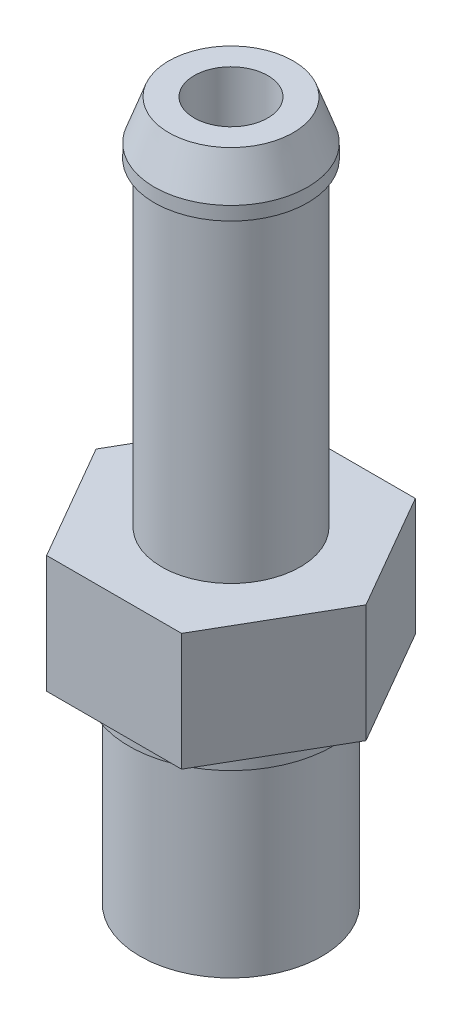
ISO-10303-21;
HEADER;
FILE_DESCRIPTION(('STEP AP214'),'2;1');
FILE_NAME('part.step','',(''),(''),'','','');
FILE_SCHEMA(('AUTOMOTIVE_DESIGN { 1 0 10303 214 1 1 1 1 }'));
ENDSEC;
DATA;
#1=APPLICATION_CONTEXT('core data for automotive mechanical design processes');
#2=APPLICATION_PROTOCOL_DEFINITION('international standard','automotive_design',2000,#1);
#3=PRODUCT_CONTEXT('',#1,'mechanical');
#4=PRODUCT('Part','Part','',(#3));
#5=PRODUCT_RELATED_PRODUCT_CATEGORY('part','',(#4));
#6=PRODUCT_DEFINITION_FORMATION('','',#4);
#7=PRODUCT_DEFINITION_CONTEXT('part definition',#1,'design');
#8=PRODUCT_DEFINITION('design','',#6,#7);
#9=PRODUCT_DEFINITION_SHAPE('','',#8);
#10=(LENGTH_UNIT() NAMED_UNIT(*) SI_UNIT(.MILLI.,.METRE.));
#11=(NAMED_UNIT(*) PLANE_ANGLE_UNIT() SI_UNIT($,.RADIAN.));
#12=(NAMED_UNIT(*) SI_UNIT($,.STERADIAN.) SOLID_ANGLE_UNIT());
#13=UNCERTAINTY_MEASURE_WITH_UNIT(LENGTH_MEASURE(1.E-05),#10,'distance_accuracy_value','');
#14=(GEOMETRIC_REPRESENTATION_CONTEXT(3) GLOBAL_UNCERTAINTY_ASSIGNED_CONTEXT((#13)) GLOBAL_UNIT_ASSIGNED_CONTEXT((#10,
#11,#12)) REPRESENTATION_CONTEXT('',''));
#15=CARTESIAN_POINT('',(0.,0.,0.));
#16=DIRECTION('',(0.,0.,1.));
#17=DIRECTION('',(1.,0.,0.));
#18=AXIS2_PLACEMENT_3D('',#15,#16,#17);
#19=CARTESIAN_POINT('',(0.,-14.2621,0.));
#20=DIRECTION('',(0.,1.,0.));
#21=DIRECTION('',(0.,0.,1.));
#22=AXIS2_PLACEMENT_3D('',#19,#20,#21);
#23=CYLINDRICAL_SURFACE('',#22,2.5146);
#24=CARTESIAN_POINT('',(0.,33.5026,0.));
#25=DIRECTION('',(0.,1.,0.));
#26=DIRECTION('',(0.,0.,1.));
#27=AXIS2_PLACEMENT_3D('',#24,#25,#26);
#28=CIRCLE('',#27,2.5146);
#29=CARTESIAN_POINT('',(0.,33.5026,2.5146));
#30=VERTEX_POINT('',#29);
#31=EDGE_CURVE('E409',#30,#30,#28,.T.);
#32=ORIENTED_EDGE('',*,*,#31,.T.);
#33=EDGE_LOOP('',(#32));
#34=FACE_BOUND('',#33,.T.);
#35=CARTESIAN_POINT('',(0.,2.1971,0.));
#36=DIRECTION('',(0.,-1.,0.));
#37=DIRECTION('',(0.,0.,-1.));
#38=AXIS2_PLACEMENT_3D('',#35,#36,#37);
#39=CIRCLE('',#38,2.5146);
#40=CARTESIAN_POINT('',(0.,2.1971,-2.5146));
#41=VERTEX_POINT('',#40);
#42=EDGE_CURVE('E42',#41,#41,#39,.F.);
#43=ORIENTED_EDGE('',*,*,#42,.F.);
#44=EDGE_LOOP('',(#43));
#45=FACE_BOUND('',#44,.T.);
#46=ADVANCED_FACE('F38',(#34,#45),#23,.F.);
#47=CARTESIAN_POINT('',(4.61204715536758,8.0391,7.98829999999995));
#48=DIRECTION('',(-0.866025403784442,0.,-0.499999999999995));
#49=DIRECTION('',(-0.499999999999995,0.,0.866025403784442));
#50=AXIS2_PLACEMENT_3D('',#47,#48,#49);
#51=PLANE('',#50);
#52=DIRECTION('',(0.499999999999995,0.,-0.866025403784441));
#53=VECTOR('',#52,1.);
#54=CARTESIAN_POINT('',(4.61204715536758,0.,7.98829999999995));
#55=LINE('',#54,#53);
#56=CARTESIAN_POINT('',(4.61204715536758,0.,7.98829999999995));
#57=VERTEX_POINT('',#56);
#58=CARTESIAN_POINT('',(9.22409431073498,0.,0.));
#59=VERTEX_POINT('',#58);
#60=EDGE_CURVE('E126',#57,#59,#55,.T.);
#61=ORIENTED_EDGE('',*,*,#60,.T.);
#62=DIRECTION('',(0.,-1.,0.));
#63=VECTOR('',#62,1.);
#64=CARTESIAN_POINT('',(9.22409431073498,8.0391,0.));
#65=LINE('',#64,#63);
#66=CARTESIAN_POINT('',(9.22409431073498,8.0391,0.));
#67=VERTEX_POINT('',#66);
#68=EDGE_CURVE('E143',#67,#59,#65,.T.);
#69=ORIENTED_EDGE('',*,*,#68,.F.);
#70=DIRECTION('',(0.499999999999995,0.,-0.866025403784441));
#71=VECTOR('',#70,1.);
#72=CARTESIAN_POINT('',(4.61204715536758,8.0391,7.98829999999995));
#73=LINE('',#72,#71);
#74=CARTESIAN_POINT('',(4.61204715536758,8.0391,7.98829999999995));
#75=VERTEX_POINT('',#74);
#76=EDGE_CURVE('E137',#75,#67,#73,.T.);
#77=ORIENTED_EDGE('',*,*,#76,.F.);
#78=DIRECTION('',(0.,-1.,0.));
#79=VECTOR('',#78,1.);
#80=CARTESIAN_POINT('',(4.61204715536758,8.0391,7.98829999999995));
#81=LINE('',#80,#79);
#82=EDGE_CURVE('E122',#75,#57,#81,.T.);
#83=ORIENTED_EDGE('',*,*,#82,.T.);
#84=EDGE_LOOP('',(#61,#69,#77,#83));
#85=FACE_BOUND('',#84,.T.);
#86=ADVANCED_FACE('F40',(#85),#51,.F.);
#87=CARTESIAN_POINT('',(9.22409431073498,8.0391,0.));
#88=DIRECTION('',(-0.866025403784438,0.,0.500000000000001));
#89=DIRECTION('',(0.500000000000001,0.,0.866025403784438));
#90=AXIS2_PLACEMENT_3D('',#87,#88,#89);
#91=PLANE('',#90);
#92=DIRECTION('',(-0.500000000000001,0.,-0.866025403784438));
#93=VECTOR('',#92,1.);
#94=CARTESIAN_POINT('',(9.22409431073498,0.,0.));
#95=LINE('',#94,#93);
#96=CARTESIAN_POINT('',(4.61204715536747,0.,-7.98830000000002));
#97=VERTEX_POINT('',#96);
#98=EDGE_CURVE('E129',#59,#97,#95,.T.);
#99=ORIENTED_EDGE('',*,*,#98,.T.);
#100=DIRECTION('',(0.,-1.,0.));
#101=VECTOR('',#100,1.);
#102=CARTESIAN_POINT('',(4.61204715536747,8.0391,-7.98830000000002));
#103=LINE('',#102,#101);
#104=CARTESIAN_POINT('',(4.61204715536747,8.0391,-7.98830000000002));
#105=VERTEX_POINT('',#104);
#106=EDGE_CURVE('E141',#105,#97,#103,.T.);
#107=ORIENTED_EDGE('',*,*,#106,.F.);
#108=DIRECTION('',(-0.500000000000001,0.,-0.866025403784438));
#109=VECTOR('',#108,1.);
#110=CARTESIAN_POINT('',(9.22409431073498,8.0391,0.));
#111=LINE('',#110,#109);
#112=EDGE_CURVE('E95',#67,#105,#111,.T.);
#113=ORIENTED_EDGE('',*,*,#112,.F.);
#114=ORIENTED_EDGE('',*,*,#68,.T.);
#115=EDGE_LOOP('',(#99,#107,#113,#114));
#116=FACE_BOUND('',#115,.T.);
#117=ADVANCED_FACE('F157',(#116),#91,.F.);
#118=CARTESIAN_POINT('',(4.61204715536747,8.0391,-7.98830000000002));
#119=DIRECTION('',(0.,0.,1.));
#120=DIRECTION('',(1.,0.,0.));
#121=AXIS2_PLACEMENT_3D('',#118,#119,#120);
#122=PLANE('',#121);
#123=DIRECTION('',(-1.,0.,0.));
#124=VECTOR('',#123,1.);
#125=CARTESIAN_POINT('',(4.61204715536747,0.,-7.98830000000002));
#126=LINE('',#125,#124);
#127=CARTESIAN_POINT('',(-4.61204715536753,0.,-7.98829999999999));
#128=VERTEX_POINT('',#127);
#129=EDGE_CURVE('E132',#97,#128,#126,.T.);
#130=ORIENTED_EDGE('',*,*,#129,.T.);
#131=DIRECTION('',(0.,-1.,0.));
#132=VECTOR('',#131,1.);
#133=CARTESIAN_POINT('',(-4.61204715536753,8.0391,-7.98829999999999));
#134=LINE('',#133,#132);
#135=CARTESIAN_POINT('',(-4.61204715536753,8.0391,-7.98829999999999));
#136=VERTEX_POINT('',#135);
#137=EDGE_CURVE('E117',#136,#128,#134,.T.);
#138=ORIENTED_EDGE('',*,*,#137,.F.);
#139=DIRECTION('',(-1.,0.,0.));
#140=VECTOR('',#139,1.);
#141=CARTESIAN_POINT('',(4.61204715536747,8.0391,-7.98830000000002));
#142=LINE('',#141,#140);
#143=EDGE_CURVE('E108',#105,#136,#142,.T.);
#144=ORIENTED_EDGE('',*,*,#143,.F.);
#145=ORIENTED_EDGE('',*,*,#106,.T.);
#146=EDGE_LOOP('',(#130,#138,#144,#145));
#147=FACE_BOUND('',#146,.T.);
#148=ADVANCED_FACE('F160',(#147),#122,.F.);
#149=CARTESIAN_POINT('',(-4.61204715536753,8.0391,-7.98829999999999));
#150=DIRECTION('',(0.866025403784442,0.,0.499999999999995));
#151=DIRECTION('',(0.499999999999995,0.,-0.866025403784442));
#152=AXIS2_PLACEMENT_3D('',#149,#150,#151);
#153=PLANE('',#152);
#154=DIRECTION('',(-0.499999999999995,0.,0.866025403784442));
#155=VECTOR('',#154,1.);
#156=CARTESIAN_POINT('',(-4.61204715536753,0.,-7.98829999999999));
#157=LINE('',#156,#155);
#158=CARTESIAN_POINT('',(-9.22409431073498,0.,0.));
#159=VERTEX_POINT('',#158);
#160=EDGE_CURVE('E116',#128,#159,#157,.T.);
#161=ORIENTED_EDGE('',*,*,#160,.T.);
#162=DIRECTION('',(0.,-1.,0.));
#163=VECTOR('',#162,1.);
#164=CARTESIAN_POINT('',(-9.22409431073498,8.0391,0.));
#165=LINE('',#164,#163);
#166=CARTESIAN_POINT('',(-9.22409431073498,8.0391,0.));
#167=VERTEX_POINT('',#166);
#168=EDGE_CURVE('E113',#167,#159,#165,.T.);
#169=ORIENTED_EDGE('',*,*,#168,.F.);
#170=DIRECTION('',(-0.499999999999995,0.,0.866025403784442));
#171=VECTOR('',#170,1.);
#172=CARTESIAN_POINT('',(-4.61204715536753,8.0391,-7.98829999999999));
#173=LINE('',#172,#171);
#174=EDGE_CURVE('E102',#136,#167,#173,.T.);
#175=ORIENTED_EDGE('',*,*,#174,.F.);
#176=ORIENTED_EDGE('',*,*,#137,.T.);
#177=EDGE_LOOP('',(#161,#169,#175,#176));
#178=FACE_BOUND('',#177,.T.);
#179=ADVANCED_FACE('F114',(#178),#153,.F.);
#180=CARTESIAN_POINT('',(-9.22409431073498,8.0391,0.));
#181=DIRECTION('',(0.866025403784435,0.,-0.500000000000007));
#182=DIRECTION('',(-0.500000000000007,0.,-0.866025403784435));
#183=AXIS2_PLACEMENT_3D('',#180,#181,#182);
#184=PLANE('',#183);
#185=DIRECTION('',(0.500000000000007,0.,0.866025403784435));
#186=VECTOR('',#185,1.);
#187=CARTESIAN_POINT('',(-9.22409431073498,0.,0.));
#188=LINE('',#187,#186);
#189=CARTESIAN_POINT('',(-4.61204715536742,0.,7.98830000000005));
#190=VERTEX_POINT('',#189);
#191=EDGE_CURVE('E80',#159,#190,#188,.T.);
#192=ORIENTED_EDGE('',*,*,#191,.T.);
#193=DIRECTION('',(0.,-1.,0.));
#194=VECTOR('',#193,1.);
#195=CARTESIAN_POINT('',(-4.61204715536742,8.0391,7.98830000000005));
#196=LINE('',#195,#194);
#197=CARTESIAN_POINT('',(-4.61204715536742,8.0391,7.98830000000005));
#198=VERTEX_POINT('',#197);
#199=EDGE_CURVE('E118',#198,#190,#196,.T.);
#200=ORIENTED_EDGE('',*,*,#199,.F.);
#201=DIRECTION('',(0.500000000000007,0.,0.866025403784435));
#202=VECTOR('',#201,1.);
#203=CARTESIAN_POINT('',(-9.22409431073498,8.0391,0.));
#204=LINE('',#203,#202);
#205=EDGE_CURVE('E106',#167,#198,#204,.T.);
#206=ORIENTED_EDGE('',*,*,#205,.F.);
#207=ORIENTED_EDGE('',*,*,#168,.T.);
#208=EDGE_LOOP('',(#192,#200,#206,#207));
#209=FACE_BOUND('',#208,.T.);
#210=ADVANCED_FACE('F120',(#209),#184,.F.);
#211=CARTESIAN_POINT('',(-4.61204715536742,8.0391,7.98830000000005));
#212=DIRECTION('',(0.,0.,-1.));
#213=DIRECTION('',(-1.,0.,0.));
#214=AXIS2_PLACEMENT_3D('',#211,#212,#213);
#215=PLANE('',#214);
#216=DIRECTION('',(1.,0.,0.));
#217=VECTOR('',#216,1.);
#218=CARTESIAN_POINT('',(-4.61204715536742,0.,7.98830000000005));
#219=LINE('',#218,#217);
#220=EDGE_CURVE('E86',#190,#57,#219,.T.);
#221=ORIENTED_EDGE('',*,*,#220,.T.);
#222=ORIENTED_EDGE('',*,*,#82,.F.);
#223=DIRECTION('',(1.,0.,0.));
#224=VECTOR('',#223,1.);
#225=CARTESIAN_POINT('',(-4.61204715536742,8.0391,7.98830000000005));
#226=LINE('',#225,#224);
#227=EDGE_CURVE('E57',#198,#75,#226,.T.);
#228=ORIENTED_EDGE('',*,*,#227,.F.);
#229=ORIENTED_EDGE('',*,*,#199,.T.);
#230=EDGE_LOOP('',(#221,#222,#228,#229));
#231=FACE_BOUND('',#230,.T.);
#232=ADVANCED_FACE('F165',(#231),#215,.F.);
#233=CARTESIAN_POINT('',(0.,8.0391,0.));
#234=DIRECTION('',(0.,1.,0.));
#235=DIRECTION('',(0.,0.,1.));
#236=AXIS2_PLACEMENT_3D('',#233,#234,#235);
#237=PLANE('',#236);
#238=CARTESIAN_POINT('',(0.,8.0391,0.));
#239=DIRECTION('',(0.,1.,0.));
#240=DIRECTION('',(0.,0.,1.));
#241=AXIS2_PLACEMENT_3D('',#238,#239,#240);
#242=CIRCLE('',#241,4.7371);
#243=CARTESIAN_POINT('',(0.,8.0391,4.7371));
#244=VERTEX_POINT('',#243);
#245=EDGE_CURVE('E144',#244,#244,#242,.T.);
#246=ORIENTED_EDGE('',*,*,#245,.F.);
#247=EDGE_LOOP('',(#246));
#248=FACE_BOUND('',#247,.T.);
#249=ORIENTED_EDGE('',*,*,#76,.T.);
#250=ORIENTED_EDGE('',*,*,#112,.T.);
#251=ORIENTED_EDGE('',*,*,#143,.T.);
#252=ORIENTED_EDGE('',*,*,#174,.T.);
#253=ORIENTED_EDGE('',*,*,#205,.T.);
#254=ORIENTED_EDGE('',*,*,#227,.T.);
#255=EDGE_LOOP('',(#249,#250,#251,#252,#253,#254));
#256=FACE_BOUND('',#255,.T.);
#257=ADVANCED_FACE('F104',(#248,#256),#237,.T.);
#258=CARTESIAN_POINT('',(0.,0.,0.));
#259=DIRECTION('',(0.,1.,0.));
#260=DIRECTION('',(0.,0.,1.));
#261=AXIS2_PLACEMENT_3D('',#258,#259,#260);
#262=PLANE('',#261);
#263=CARTESIAN_POINT('',(0.,0.,0.));
#264=DIRECTION('',(0.,-1.,0.));
#265=DIRECTION('',(0.,0.,-1.));
#266=AXIS2_PLACEMENT_3D('',#263,#264,#265);
#267=CIRCLE('',#266,6.96595);
#268=CARTESIAN_POINT('',(0.,0.,-6.96595));
#269=VERTEX_POINT('',#268);
#270=EDGE_CURVE('E48',#269,#269,#267,.T.);
#271=ORIENTED_EDGE('',*,*,#270,.F.);
#272=EDGE_LOOP('',(#271));
#273=FACE_BOUND('',#272,.T.);
#274=ORIENTED_EDGE('',*,*,#60,.F.);
#275=ORIENTED_EDGE('',*,*,#220,.F.);
#276=ORIENTED_EDGE('',*,*,#191,.F.);
#277=ORIENTED_EDGE('',*,*,#160,.F.);
#278=ORIENTED_EDGE('',*,*,#129,.F.);
#279=ORIENTED_EDGE('',*,*,#98,.F.);
#280=EDGE_LOOP('',(#274,#275,#276,#277,#278,#279));
#281=FACE_BOUND('',#280,.T.);
#282=ADVANCED_FACE('F163',(#273,#281),#262,.F.);
#283=CARTESIAN_POINT('',(0.,29.845,0.));
#284=DIRECTION('',(0.,-1.,0.));
#285=DIRECTION('',(0.,0.,-1.));
#286=AXIS2_PLACEMENT_3D('',#283,#284,#285);
#287=CYLINDRICAL_SURFACE('',#286,4.7371);
#288=CARTESIAN_POINT('',(0.,29.845,0.));
#289=DIRECTION('',(0.,1.,0.));
#290=DIRECTION('',(0.,0.,1.));
#291=AXIS2_PLACEMENT_3D('',#288,#289,#290);
#292=CIRCLE('',#291,4.7371);
#293=CARTESIAN_POINT('',(0.,29.845,4.7371));
#294=VERTEX_POINT('',#293);
#295=EDGE_CURVE('E130',#294,#294,#292,.T.);
#296=ORIENTED_EDGE('',*,*,#295,.F.);
#297=EDGE_LOOP('',(#296));
#298=FACE_BOUND('',#297,.T.);
#299=ORIENTED_EDGE('',*,*,#245,.T.);
#300=EDGE_LOOP('',(#299));
#301=FACE_BOUND('',#300,.T.);
#302=ADVANCED_FACE('F220',(#298,#301),#287,.T.);
#303=CARTESIAN_POINT('',(0.,30.7721,0.));
#304=DIRECTION('',(0.,-1.,0.));
#305=DIRECTION('',(0.,0.,-1.));
#306=AXIS2_PLACEMENT_3D('',#303,#304,#305);
#307=CYLINDRICAL_SURFACE('',#306,5.23875);
#308=CARTESIAN_POINT('',(0.,30.7721,0.));
#309=DIRECTION('',(0.,1.,0.));
#310=DIRECTION('',(0.,0.,1.));
#311=AXIS2_PLACEMENT_3D('',#308,#309,#310);
#312=CIRCLE('',#311,5.23875);
#313=CARTESIAN_POINT('',(0.,30.7721,5.23875));
#314=VERTEX_POINT('',#313);
#315=EDGE_CURVE('E421',#314,#314,#312,.T.);
#316=ORIENTED_EDGE('',*,*,#315,.F.);
#317=EDGE_LOOP('',(#316));
#318=FACE_BOUND('',#317,.T.);
#319=CARTESIAN_POINT('',(0.,29.845,0.));
#320=DIRECTION('',(0.,1.,0.));
#321=DIRECTION('',(0.,0.,1.));
#322=AXIS2_PLACEMENT_3D('',#319,#320,#321);
#323=CIRCLE('',#322,5.23875);
#324=CARTESIAN_POINT('',(0.,29.845,5.23875));
#325=VERTEX_POINT('',#324);
#326=EDGE_CURVE('E420',#325,#325,#323,.T.);
#327=ORIENTED_EDGE('',*,*,#326,.T.);
#328=EDGE_LOOP('',(#327));
#329=FACE_BOUND('',#328,.T.);
#330=ADVANCED_FACE('F216',(#318,#329),#307,.T.);
#331=CARTESIAN_POINT('',(0.,29.845,0.));
#332=DIRECTION('',(0.,1.,0.));
#333=DIRECTION('',(0.,0.,1.));
#334=AXIS2_PLACEMENT_3D('',#331,#332,#333);
#335=PLANE('',#334);
#336=ORIENTED_EDGE('',*,*,#295,.T.);
#337=EDGE_LOOP('',(#336));
#338=FACE_BOUND('',#337,.T.);
#339=ORIENTED_EDGE('',*,*,#326,.F.);
#340=EDGE_LOOP('',(#339));
#341=FACE_BOUND('',#340,.T.);
#342=ADVANCED_FACE('F212',(#338,#341),#335,.F.);
#343=CARTESIAN_POINT('',(0.,33.5026,0.));
#344=DIRECTION('',(0.,-1.,0.));
#345=DIRECTION('',(0.,0.,-1.));
#346=AXIS2_PLACEMENT_3D('',#343,#344,#345);
#347=PLANE('',#346);
#348=ORIENTED_EDGE('',*,*,#31,.F.);
#349=EDGE_LOOP('',(#348));
#350=FACE_BOUND('',#349,.T.);
#351=CARTESIAN_POINT('',(0.,33.5026,0.));
#352=DIRECTION('',(0.,-1.,0.));
#353=DIRECTION('',(0.,0.,-1.));
#354=AXIS2_PLACEMENT_3D('',#351,#352,#353);
#355=CIRCLE('',#354,4.2545);
#356=CARTESIAN_POINT('',(0.,33.5026,-4.2545));
#357=VERTEX_POINT('',#356);
#358=EDGE_CURVE('E416',#357,#357,#355,.T.);
#359=ORIENTED_EDGE('',*,*,#358,.F.);
#360=EDGE_LOOP('',(#359));
#361=FACE_BOUND('',#360,.T.);
#362=ADVANCED_FACE('F208',(#350,#361),#347,.F.);
#363=CARTESIAN_POINT('',(0.,33.5026,0.));
#364=DIRECTION('',(0.,-1.,0.));
#365=DIRECTION('',(0.,0.,-1.));
#366=AXIS2_PLACEMENT_3D('',#363,#364,#365);
#367=CONICAL_SURFACE('',#366,4.2545,0.345967272612796);
#368=ORIENTED_EDGE('',*,*,#315,.T.);
#369=EDGE_LOOP('',(#368));
#370=FACE_BOUND('',#369,.T.);
#371=ORIENTED_EDGE('',*,*,#358,.T.);
#372=EDGE_LOOP('',(#371));
#373=FACE_BOUND('',#372,.T.);
#374=ADVANCED_FACE('F204',(#370,#373),#367,.T.);
#375=CARTESIAN_POINT('',(0.,-1.4605,0.));
#376=DIRECTION('',(0.,1.,0.));
#377=DIRECTION('',(0.,0.,1.));
#378=AXIS2_PLACEMENT_3D('',#375,#376,#377);
#379=CYLINDRICAL_SURFACE('',#378,6.96595);
#380=CARTESIAN_POINT('',(0.,-1.4605,0.));
#381=DIRECTION('',(0.,-1.,0.));
#382=DIRECTION('',(0.,0.,-1.));
#383=AXIS2_PLACEMENT_3D('',#380,#381,#382);
#384=CIRCLE('',#383,6.96595);
#385=CARTESIAN_POINT('',(0.,-1.4605,-6.96595));
#386=VERTEX_POINT('',#385);
#387=EDGE_CURVE('E413',#386,#386,#384,.T.);
#388=ORIENTED_EDGE('',*,*,#387,.F.);
#389=EDGE_LOOP('',(#388));
#390=FACE_BOUND('',#389,.T.);
#391=ORIENTED_EDGE('',*,*,#270,.T.);
#392=EDGE_LOOP('',(#391));
#393=FACE_BOUND('',#392,.T.);
#394=ADVANCED_FACE('F200',(#390,#393),#379,.T.);
#395=CARTESIAN_POINT('',(0.,-1.4605,0.));
#396=DIRECTION('',(0.,-1.,0.));
#397=DIRECTION('',(0.,0.,-1.));
#398=AXIS2_PLACEMENT_3D('',#395,#396,#397);
#399=PLANE('',#398);
#400=CARTESIAN_POINT('',(0.,-1.4605,0.));
#401=DIRECTION('',(0.,-1.,0.));
#402=DIRECTION('',(0.,0.,-1.));
#403=AXIS2_PLACEMENT_3D('',#400,#401,#402);
#404=CIRCLE('',#403,6.223);
#405=CARTESIAN_POINT('',(0.,-1.4605,-6.223));
#406=VERTEX_POINT('',#405);
#407=EDGE_CURVE('E11',#406,#406,#404,.T.);
#408=ORIENTED_EDGE('',*,*,#407,.F.);
#409=EDGE_LOOP('',(#408));
#410=FACE_BOUND('',#409,.T.);
#411=ORIENTED_EDGE('',*,*,#387,.T.);
#412=EDGE_LOOP('',(#411));
#413=FACE_BOUND('',#412,.T.);
#414=ADVANCED_FACE('F196',(#410,#413),#399,.T.);
#415=CARTESIAN_POINT('',(0.,-14.2621,0.));
#416=DIRECTION('',(0.,1.,0.));
#417=DIRECTION('',(0.,0.,1.));
#418=AXIS2_PLACEMENT_3D('',#415,#416,#417);
#419=CYLINDRICAL_SURFACE('',#418,6.223);
#420=CARTESIAN_POINT('',(0.,-14.2621,0.));
#421=DIRECTION('',(0.,-1.,0.));
#422=DIRECTION('',(0.,0.,-1.));
#423=AXIS2_PLACEMENT_3D('',#420,#421,#422);
#424=CIRCLE('',#423,6.223);
#425=CARTESIAN_POINT('',(0.,-14.2621,-6.223));
#426=VERTEX_POINT('',#425);
#427=EDGE_CURVE('E411',#426,#426,#424,.T.);
#428=ORIENTED_EDGE('',*,*,#427,.F.);
#429=EDGE_LOOP('',(#428));
#430=FACE_BOUND('',#429,.T.);
#431=ORIENTED_EDGE('',*,*,#407,.T.);
#432=EDGE_LOOP('',(#431));
#433=FACE_BOUND('',#432,.T.);
#434=ADVANCED_FACE('F192',(#430,#433),#419,.T.);
#435=CARTESIAN_POINT('',(0.,-14.2621,0.));
#436=DIRECTION('',(0.,-1.,0.));
#437=DIRECTION('',(0.,0.,-1.));
#438=AXIS2_PLACEMENT_3D('',#435,#436,#437);
#439=PLANE('',#438);
#440=CARTESIAN_POINT('',(0.,-14.2621,0.));
#441=DIRECTION('',(0.,-1.,0.));
#442=DIRECTION('',(0.,0.,-1.));
#443=AXIS2_PLACEMENT_3D('',#440,#441,#442);
#444=CIRCLE('',#443,3.62585);
#445=CARTESIAN_POINT('',(0.,-14.2621,-3.62585));
#446=VERTEX_POINT('',#445);
#447=EDGE_CURVE('E405',#446,#446,#444,.T.);
#448=ORIENTED_EDGE('',*,*,#447,.F.);
#449=EDGE_LOOP('',(#448));
#450=FACE_BOUND('',#449,.T.);
#451=ORIENTED_EDGE('',*,*,#427,.T.);
#452=EDGE_LOOP('',(#451));
#453=FACE_BOUND('',#452,.T.);
#454=ADVANCED_FACE('F188',(#450,#453),#439,.T.);
#455=CARTESIAN_POINT('',(0.,2.1971,0.));
#456=DIRECTION('',(0.,-1.,0.));
#457=DIRECTION('',(0.,0.,-1.));
#458=AXIS2_PLACEMENT_3D('',#455,#456,#457);
#459=PLANE('',#458);
#460=CARTESIAN_POINT('',(0.,2.1971,0.));
#461=DIRECTION('',(0.,-1.,0.));
#462=DIRECTION('',(0.,0.,-1.));
#463=AXIS2_PLACEMENT_3D('',#460,#461,#462);
#464=CIRCLE('',#463,3.62585);
#465=CARTESIAN_POINT('',(0.,2.1971,-3.62585));
#466=VERTEX_POINT('',#465);
#467=EDGE_CURVE('E402',#466,#466,#464,.T.);
#468=ORIENTED_EDGE('',*,*,#467,.T.);
#469=EDGE_LOOP('',(#468));
#470=FACE_BOUND('',#469,.T.);
#471=ORIENTED_EDGE('',*,*,#42,.T.);
#472=EDGE_LOOP('',(#471));
#473=FACE_BOUND('',#472,.T.);
#474=ADVANCED_FACE('F191',(#470,#473),#459,.T.);
#475=CARTESIAN_POINT('',(0.,2.1971,0.));
#476=DIRECTION('',(0.,-1.,0.));
#477=DIRECTION('',(0.,0.,-1.));
#478=AXIS2_PLACEMENT_3D('',#475,#476,#477);
#479=CYLINDRICAL_SURFACE('',#478,3.62585);
#480=ORIENTED_EDGE('',*,*,#467,.F.);
#481=EDGE_LOOP('',(#480));
#482=FACE_BOUND('',#481,.T.);
#483=ORIENTED_EDGE('',*,*,#447,.T.);
#484=EDGE_LOOP('',(#483));
#485=FACE_BOUND('',#484,.T.);
#486=ADVANCED_FACE('F186',(#482,#485),#479,.F.);
#487=CLOSED_SHELL('',(#46,#86,#117,#148,#179,#210,#232,#257,#282,#302,#330,#342,#362,#374,#394,
#414,#434,#454,#474,#486));
#488=MANIFOLD_SOLID_BREP('B2',#487);
#489=ADVANCED_BREP_SHAPE_REPRESENTATION('',(#18,#488),#14);
#490=SHAPE_DEFINITION_REPRESENTATION(#9,#489);
ENDSEC;
END-ISO-10303-21;
